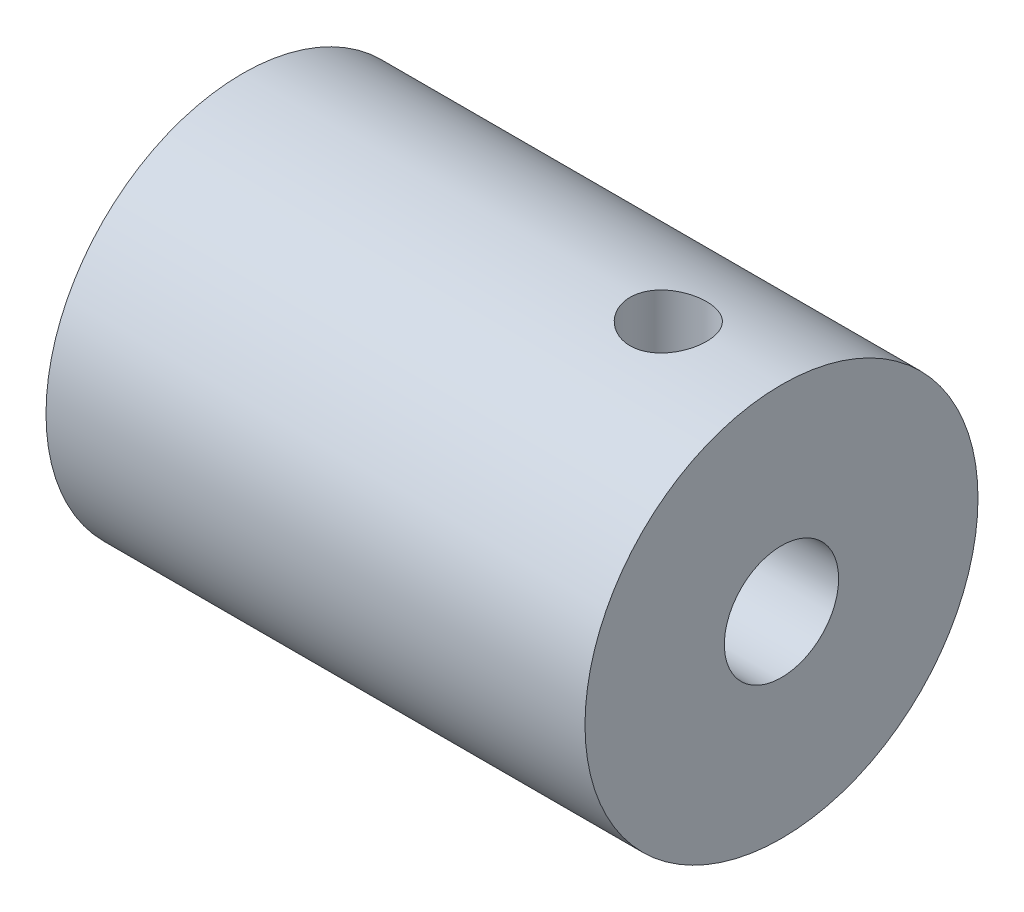
ISO-10303-21;
HEADER;
FILE_DESCRIPTION(('STEP AP214'),'2;1');
FILE_NAME('part.step','',(''),(''),'','','');
FILE_SCHEMA(('AUTOMOTIVE_DESIGN { 1 0 10303 214 1 1 1 1 }'));
ENDSEC;
DATA;
#1=APPLICATION_CONTEXT('core data for automotive mechanical design processes');
#2=APPLICATION_PROTOCOL_DEFINITION('international standard','automotive_design',2000,#1);
#3=PRODUCT_CONTEXT('',#1,'mechanical');
#4=PRODUCT('Part','Part','',(#3));
#5=PRODUCT_RELATED_PRODUCT_CATEGORY('part','',(#4));
#6=PRODUCT_DEFINITION_FORMATION('','',#4);
#7=PRODUCT_DEFINITION_CONTEXT('part definition',#1,'design');
#8=PRODUCT_DEFINITION('design','',#6,#7);
#9=PRODUCT_DEFINITION_SHAPE('','',#8);
#10=(LENGTH_UNIT() NAMED_UNIT(*) SI_UNIT(.MILLI.,.METRE.));
#11=(NAMED_UNIT(*) PLANE_ANGLE_UNIT() SI_UNIT($,.RADIAN.));
#12=(NAMED_UNIT(*) SI_UNIT($,.STERADIAN.) SOLID_ANGLE_UNIT());
#13=UNCERTAINTY_MEASURE_WITH_UNIT(LENGTH_MEASURE(1.E-05),#10,'distance_accuracy_value','');
#14=(GEOMETRIC_REPRESENTATION_CONTEXT(3) GLOBAL_UNCERTAINTY_ASSIGNED_CONTEXT((#13)) GLOBAL_UNIT_ASSIGNED_CONTEXT((#10,
#11,#12)) REPRESENTATION_CONTEXT('',''));
#15=CARTESIAN_POINT('',(0.,0.,0.));
#16=DIRECTION('',(0.,0.,1.));
#17=DIRECTION('',(1.,0.,0.));
#18=AXIS2_PLACEMENT_3D('',#15,#16,#17);
#19=CARTESIAN_POINT('',(19.05,0.,0.));
#20=DIRECTION('',(-1.,0.,0.));
#21=DIRECTION('',(0.,0.,1.));
#22=AXIS2_PLACEMENT_3D('',#19,#20,#21);
#23=CYLINDRICAL_SURFACE('',#22,6.9453125);
#24=CARTESIAN_POINT('',(15.05,6.8123398491382,-1.35255));
#25=CARTESIAN_POINT('',(15.1251963577295,6.81234132944243,-1.35254717398923));
#26=CARTESIAN_POINT('',(15.200428762226,6.81359843401604,-1.34625778721366));
#27=CARTESIAN_POINT('',(15.348768251679,6.81848412206213,-1.32128566413576));
#28=CARTESIAN_POINT('',(15.4218735408361,6.82211465188462,-1.30259275601873));
#29=CARTESIAN_POINT('',(15.5637911387709,6.83132076951789,-1.2534127393944));
#30=CARTESIAN_POINT('',(15.632607526736,6.83689447483278,-1.22293704263114));
#31=CARTESIAN_POINT('',(15.7641477149729,6.84935669337498,-1.15108735760462));
#32=CARTESIAN_POINT('',(15.8268719126619,6.85624512075079,-1.10971408088743));
#33=CARTESIAN_POINT('',(15.9452925006859,6.87066385671159,-1.01665206477721));
#34=CARTESIAN_POINT('',(16.0008952826627,6.87820088946583,-0.964845232866628));
#35=CARTESIAN_POINT('',(16.10267816224,6.89300833236928,-0.852641895271079));
#36=CARTESIAN_POINT('',(16.1488576175121,6.90027872431559,-0.792244804518553));
#37=CARTESIAN_POINT('',(16.2308442848889,6.91380602435712,-0.663957660798625));
#38=CARTESIAN_POINT('',(16.2665628384305,6.92005408202254,-0.59600993407313));
#39=CARTESIAN_POINT('',(16.3260420698983,6.9307573061903,-0.454935726377398));
#40=CARTESIAN_POINT('',(16.3498038086829,6.93521263174426,-0.381809705503897));
#41=CARTESIAN_POINT('',(16.3844043282608,6.94178089710671,-0.233425551842965));
#42=CARTESIAN_POINT('',(16.3954010670289,6.9439224447993,-0.15820553937453));
#43=CARTESIAN_POINT('',(16.4046519738567,6.94572057813347,-0.00695979172285046));
#44=CARTESIAN_POINT('',(16.4029073086999,6.94537739131254,0.0690658690471726));
#45=CARTESIAN_POINT('',(16.3868453102374,6.9422669717941,0.218680332558394));
#46=CARTESIAN_POINT('',(16.3726980950461,6.93953253959101,0.29228817930842));
#47=CARTESIAN_POINT('',(16.3325020833561,6.93198377446194,0.43606478492695));
#48=CARTESIAN_POINT('',(16.3064528284456,6.92716936142506,0.506233411217254));
#49=CARTESIAN_POINT('',(16.2430326622553,6.91594719761631,0.641628535389237));
#50=CARTESIAN_POINT('',(16.2055945231603,6.90953002726852,0.706822730581111));
#51=CARTESIAN_POINT('',(16.1205089749944,6.8958107388115,0.830066733820544));
#52=CARTESIAN_POINT('',(16.0728604493921,6.8885085239584,0.888115759431995));
#53=CARTESIAN_POINT('',(15.9677716391563,6.87368422512004,0.996430503329032));
#54=CARTESIAN_POINT('',(15.9101824922377,6.86616050202488,1.04655167379456));
#55=CARTESIAN_POINT('',(15.7873409912348,6.85185605155822,1.13644734813693));
#56=CARTESIAN_POINT('',(15.7220885068441,6.84507533682456,1.17622167604021));
#57=CARTESIAN_POINT('',(15.5855718504126,6.83302176871437,1.24434075650037));
#58=CARTESIAN_POINT('',(15.5142962361661,6.82775187280059,1.27266313545955));
#59=CARTESIAN_POINT('',(15.3678719235205,6.81936078602225,1.31688875248936));
#60=CARTESIAN_POINT('',(15.2927237027049,6.81623933088277,1.33279351805539));
#61=CARTESIAN_POINT('',(15.1419946128911,6.81255121296574,1.35151853370847));
#62=CARTESIAN_POINT('',(15.0664405857977,6.81194388677569,1.35454706540156));
#63=CARTESIAN_POINT('',(14.9159067067836,6.81324378378274,1.34799319340968));
#64=CARTESIAN_POINT('',(14.8409268243126,6.81515087223908,1.33841146547496));
#65=CARTESIAN_POINT('',(14.6943631450238,6.8212267242659,1.30708830417719));
#66=CARTESIAN_POINT('',(14.622754827821,6.82537494574984,1.28545725904049));
#67=CARTESIAN_POINT('',(14.4841788007416,6.83544778587379,1.23076713319852));
#68=CARTESIAN_POINT('',(14.4172114565884,6.84137254431507,1.19770715308316));
#69=CARTESIAN_POINT('',(14.2889042949397,6.85442277455985,1.12062275552649));
#70=CARTESIAN_POINT('',(14.2276445449578,6.86156222266883,1.07646747728023));
#71=CARTESIAN_POINT('',(14.1133282860528,6.87619863792382,0.978621189653175));
#72=CARTESIAN_POINT('',(14.0602725765284,6.88369563981674,0.924929252117597));
#73=CARTESIAN_POINT('',(13.9630857130608,6.89833385623375,0.808600781761834));
#74=CARTESIAN_POINT('',(13.9190950668739,6.90546833851409,0.745845878648363));
#75=CARTESIAN_POINT('',(13.8422815495203,6.91846222457379,0.613715329874588));
#76=CARTESIAN_POINT('',(13.8094582254823,6.92432168005618,0.5443399528422));
#77=CARTESIAN_POINT('',(13.7561182604404,6.93407647600256,0.401315189591162));
#78=CARTESIAN_POINT('',(13.7355342900877,6.93798254290923,0.327691677235406));
#79=CARTESIAN_POINT('',(13.7070433240212,6.94343635498537,0.177948781292183));
#80=CARTESIAN_POINT('',(13.6991348843364,6.94498436877851,0.101829683005132));
#81=CARTESIAN_POINT('',(13.6962729803831,6.9455417360436,-0.0493992693728448));
#82=CARTESIAN_POINT('',(13.7011078582644,6.94459256651257,-0.12450504619502));
#83=CARTESIAN_POINT('',(13.7231296219406,6.94034898695306,-0.272812141533531));
#84=CARTESIAN_POINT('',(13.7403163686517,6.937054603332,-0.346013481484464));
#85=CARTESIAN_POINT('',(13.7864619917275,6.92849141799562,-0.488310450349137));
#86=CARTESIAN_POINT('',(13.8153966735495,6.92322667591105,-0.55741418495149));
#87=CARTESIAN_POINT('',(13.8841906690659,6.91129094519554,-0.689816781806988));
#88=CARTESIAN_POINT('',(13.9240507906703,6.90461985257679,-0.753115214309866));
#89=CARTESIAN_POINT('',(14.0142844073817,6.89047678695011,-0.873160470640879));
#90=CARTESIAN_POINT('',(14.064809971234,6.88299408712887,-0.929791739208906));
#91=CARTESIAN_POINT('',(14.1746264325819,6.86813654926997,-1.03384496720176));
#92=CARTESIAN_POINT('',(14.2339193962609,6.86076173710927,-1.08126474967521));
#93=CARTESIAN_POINT('',(14.3603060903541,6.84687312303262,-1.16600241942765));
#94=CARTESIAN_POINT('',(14.4274726420297,6.84036878216862,-1.20321330291691));
#95=CARTESIAN_POINT('',(14.5672111257225,6.82907234997402,-1.265762608787));
#96=CARTESIAN_POINT('',(14.6397779967701,6.82427867929455,-1.29111198887677));
#97=CARTESIAN_POINT('',(14.7687757463542,6.81792155952706,-1.32420167504548));
#98=CARTESIAN_POINT('',(14.8244623195154,6.81584115709694,-1.33481362155619));
#99=CARTESIAN_POINT('',(14.9367591328958,6.81304976587542,-1.34898873810212));
#100=CARTESIAN_POINT('',(14.9933693442121,6.8123387343156,-1.35255212827918));
#101=CARTESIAN_POINT('',(15.05,6.8123398491382,-1.35255));
#102=B_SPLINE_CURVE_WITH_KNOTS('',3,(#24,#25,#26,#27,#28,#29,#30,#31,#32,#33,#34,#35,#36,#37,
#38,#39,#40,#41,#42,#43,#44,#45,#46,#47,#48,#49,#50,#51,#52,#53,#54,#55,#56,#57,#58,#59,#60,#61,
#62,#63,#64,#65,#66,#67,#68,#69,#70,#71,#72,#73,#74,#75,#76,#77,#78,#79,#80,#81,#82,#83,#84,#85,
#86,#87,#88,#89,#90,#91,#92,#93,#94,#95,#96,#97,#98,#99,#100,#101),.UNSPECIFIED.,.T.,.F.,(4,2,2,
2,2,2,2,2,2,2,2,2,2,2,2,2,2,2,2,2,2,2,2,2,2,2,2,2,2,2,2,2,2,2,2,2,2,2,4),(0.,0.225381769754468,
0.450948598218698,0.676297508094499,0.901631707695203,1.12967631697796,1.35773646542581,
1.58767697261879,1.81759707493496,2.04464068123138,2.27166349646072,2.49562026008974,
2.71958565022874,2.94489962695416,3.1702382549135,3.39930238955306,3.62837041973823,
3.8578838410403,4.08736902535801,4.31312766682919,4.53887421098822,4.76258583726276,
4.98631507272979,5.21281822177313,5.43934342731297,5.66915209518004,5.89895144244596,
6.12747466637739,6.35597185555189,6.58069787216742,6.80542135837772,7.02968436164319,
7.25396395309363,7.4816881775234,7.7094661547394,7.93954751825051,8.16941590989803,
8.3391570577479,8.5088929041268),.UNSPECIFIED.);
#103=CARTESIAN_POINT('',(15.05,6.8123398491382,-1.35255));
#104=VERTEX_POINT('',#103);
#105=EDGE_CURVE('E67',#104,#104,#102,.T.);
#106=ORIENTED_EDGE('',*,*,#105,.T.);
#107=EDGE_LOOP('',(#106));
#108=FACE_BOUND('',#107,.T.);
#109=CARTESIAN_POINT('',(19.05,0.,0.));
#110=DIRECTION('',(1.,0.,0.));
#111=DIRECTION('',(0.,0.,-1.));
#112=AXIS2_PLACEMENT_3D('',#109,#110,#111);
#113=CIRCLE('',#112,6.9453125);
#114=CARTESIAN_POINT('',(19.05,0.,-6.9453125));
#115=VERTEX_POINT('',#114);
#116=EDGE_CURVE('E11',#115,#115,#113,.T.);
#117=ORIENTED_EDGE('',*,*,#116,.F.);
#118=EDGE_LOOP('',(#117));
#119=FACE_BOUND('',#118,.T.);
#120=CARTESIAN_POINT('',(0.,0.,0.));
#121=DIRECTION('',(1.,0.,0.));
#122=DIRECTION('',(0.,0.,-1.));
#123=AXIS2_PLACEMENT_3D('',#120,#121,#122);
#124=CIRCLE('',#123,6.9453125);
#125=CARTESIAN_POINT('',(0.,0.,-6.9453125));
#126=VERTEX_POINT('',#125);
#127=EDGE_CURVE('E38',#126,#126,#124,.T.);
#128=ORIENTED_EDGE('',*,*,#127,.T.);
#129=EDGE_LOOP('',(#128));
#130=FACE_BOUND('',#129,.T.);
#131=ADVANCED_FACE('F35',(#108,#119,#130),#23,.T.);
#132=CARTESIAN_POINT('',(19.05,0.,0.));
#133=DIRECTION('',(1.,0.,0.));
#134=DIRECTION('',(0.,0.,-1.));
#135=AXIS2_PLACEMENT_3D('',#132,#133,#134);
#136=PLANE('',#135);
#137=CARTESIAN_POINT('',(19.05,0.,0.));
#138=DIRECTION('',(1.,0.,0.));
#139=DIRECTION('',(0.,0.,-1.));
#140=AXIS2_PLACEMENT_3D('',#137,#138,#139);
#141=CIRCLE('',#140,2.01929999999999);
#142=CARTESIAN_POINT('',(19.05,0.,-2.01929999999999));
#143=VERTEX_POINT('',#142);
#144=EDGE_CURVE('E54',#143,#143,#141,.T.);
#145=ORIENTED_EDGE('',*,*,#144,.F.);
#146=EDGE_LOOP('',(#145));
#147=FACE_BOUND('',#146,.T.);
#148=ORIENTED_EDGE('',*,*,#116,.T.);
#149=EDGE_LOOP('',(#148));
#150=FACE_BOUND('',#149,.T.);
#151=ADVANCED_FACE('F85',(#147,#150),#136,.T.);
#152=CARTESIAN_POINT('',(0.,0.,0.));
#153=DIRECTION('',(1.,0.,0.));
#154=DIRECTION('',(0.,0.,-1.));
#155=AXIS2_PLACEMENT_3D('',#152,#153,#154);
#156=PLANE('',#155);
#157=ORIENTED_EDGE('',*,*,#127,.F.);
#158=EDGE_LOOP('',(#157));
#159=FACE_BOUND('',#158,.T.);
#160=ADVANCED_FACE('F48',(#159),#156,.F.);
#161=CARTESIAN_POINT('',(12.0499886,0.,0.));
#162=DIRECTION('',(1.,0.,0.));
#163=DIRECTION('',(0.,0.,-1.));
#164=AXIS2_PLACEMENT_3D('',#161,#162,#163);
#165=CONICAL_SURFACE('',#164,2.01929999999999,1.02974425867665);
#166=CARTESIAN_POINT('',(10.8366707519977,0.,0.));
#167=VERTEX_POINT('',#166);
#168=VERTEX_LOOP('',#167);
#169=FACE_BOUND('',#168,.T.);
#170=CARTESIAN_POINT('',(12.0499886,0.,0.));
#171=DIRECTION('',(1.,0.,0.));
#172=DIRECTION('',(0.,0.,-1.));
#173=AXIS2_PLACEMENT_3D('',#170,#171,#172);
#174=CIRCLE('',#173,2.01929999999999);
#175=CARTESIAN_POINT('',(12.0499886,0.,-2.01929999999999));
#176=VERTEX_POINT('',#175);
#177=EDGE_CURVE('E52',#176,#176,#174,.T.);
#178=ORIENTED_EDGE('',*,*,#177,.T.);
#179=EDGE_LOOP('',(#178));
#180=FACE_BOUND('',#179,.T.);
#181=ADVANCED_FACE('F44',(#169,#180),#165,.F.);
#182=CARTESIAN_POINT('',(19.05,0.,0.));
#183=DIRECTION('',(1.,0.,0.));
#184=DIRECTION('',(0.,0.,-1.));
#185=AXIS2_PLACEMENT_3D('',#182,#183,#184);
#186=CYLINDRICAL_SURFACE('',#185,2.01929999999999);
#187=CARTESIAN_POINT('',(15.05,1.49939353990204,-1.35255));
#188=CARTESIAN_POINT('',(14.9841004087731,1.49940434840804,-1.35254380041712));
#189=CARTESIAN_POINT('',(14.9181515751606,1.50382259731787,-1.34768901249495));
#190=CARTESIAN_POINT('',(14.7886203747452,1.52063637853052,-1.32867751747527));
#191=CARTESIAN_POINT('',(14.7250431646612,1.53304833113076,-1.314501662212));
#192=CARTESIAN_POINT('',(14.6025422120036,1.56361894082946,-1.27797629332161));
#193=CARTESIAN_POINT('',(14.543579031513,1.5817201938109,-1.25570809395549));
#194=CARTESIAN_POINT('',(14.4303264388356,1.62153016132454,-1.20386038892654));
#195=CARTESIAN_POINT('',(14.3760378683645,1.6432395234836,-1.17427957024136));
#196=CARTESIAN_POINT('',(14.2643097028999,1.69191479485549,-1.10323536131488));
#197=CARTESIAN_POINT('',(14.2077193905291,1.71917021004821,-1.06063446266398));
#198=CARTESIAN_POINT('',(14.1017507980569,1.77349653198395,-0.967065961592576));
#199=CARTESIAN_POINT('',(14.0523796945048,1.80056722996342,-0.91609013917948));
#200=CARTESIAN_POINT('',(13.955057930227,1.85614049289305,-0.798219097004071));
#201=CARTESIAN_POINT('',(13.9083732223469,1.88427254705944,-0.730085850808154));
#202=CARTESIAN_POINT('',(13.8275313435529,1.93432289727914,-0.584683649796939));
#203=CARTESIAN_POINT('',(13.7933600885394,1.95624817281529,-0.507425096054492));
#204=CARTESIAN_POINT('',(13.7427328047347,1.98917166857348,-0.35515180458327));
#205=CARTESIAN_POINT('',(13.7247114652308,2.00112457636288,-0.280869760477749));
#206=CARTESIAN_POINT('',(13.7014964703543,2.01657227218721,-0.129498436571045));
#207=CARTESIAN_POINT('',(13.6962864236461,2.02007786797206,-0.0524128720696827));
#208=CARTESIAN_POINT('',(13.6988435388095,2.01836788140775,0.0895408881547876));
#209=CARTESIAN_POINT('',(13.7047420128749,2.01440802841086,0.154468697148764));
#210=CARTESIAN_POINT('',(13.7256314746373,2.0005178321981,0.282177949102503));
#211=CARTESIAN_POINT('',(13.7406231250834,1.99058705379654,0.344959235262297));
#212=CARTESIAN_POINT('',(13.7788618121236,1.96564624647717,0.4665258573));
#213=CARTESIAN_POINT('',(13.802071434946,1.95065925123113,0.525327887664788));
#214=CARTESIAN_POINT('',(13.8558434877525,1.91670464102705,0.638195419675022));
#215=CARTESIAN_POINT('',(13.8864072383299,1.89773631121212,0.692260068239309));
#216=CARTESIAN_POINT('',(13.9584922472908,1.85435493805525,0.801779402175277));
#217=CARTESIAN_POINT('',(14.0009269463546,1.82955375865744,0.856477363841794));
#218=CARTESIAN_POINT('',(14.0931789589937,1.77826207252142,0.958448230635065));
#219=CARTESIAN_POINT('',(14.1430076818395,1.75176899175344,1.00570942410655));
#220=CARTESIAN_POINT('',(14.257713893912,1.69499965905825,1.09907960384728));
#221=CARTESIAN_POINT('',(14.3237257486945,1.66478294847517,1.14384109128564));
#222=CARTESIAN_POINT('',(14.4639626091151,1.60857705620192,1.22161958976007));
#223=CARTESIAN_POINT('',(14.5381737041258,1.58258089364044,1.25465610376161));
#224=CARTESIAN_POINT('',(14.6713310924404,1.54555608514135,1.29977911769434));
#225=CARTESIAN_POINT('',(14.7285567286291,1.53237306258065,1.31515627826555));
#226=CARTESIAN_POINT('',(14.845542775869,1.51217866490722,1.33833099679276));
#227=CARTESIAN_POINT('',(14.9052986034454,1.50515659168984,1.34614169590406));
#228=CARTESIAN_POINT('',(15.0260254289342,1.4983705888663,1.35369431311021));
#229=CARTESIAN_POINT('',(15.0870007273873,1.49863992320187,1.353399252036));
#230=CARTESIAN_POINT('',(15.2079025827395,1.5064742572483,1.34467019046974));
#231=CARTESIAN_POINT('',(15.2678283918729,1.51404425930276,1.33623060943252));
#232=CARTESIAN_POINT('',(15.3818939855673,1.53471144288397,1.31242568254404));
#233=CARTESIAN_POINT('',(15.4361726807079,1.54750185296761,1.29744192385913));
#234=CARTESIAN_POINT('',(15.5414867105181,1.57707971238788,1.26132340540602));
#235=CARTESIAN_POINT('',(15.5925195018992,1.59387024826094,1.24018389298371));
#236=CARTESIAN_POINT('',(15.7139359314497,1.63843424142878,1.18111491098168));
#237=CARTESIAN_POINT('',(15.7822193080627,1.66767366029887,1.13995560148576));
#238=CARTESIAN_POINT('',(15.9102271196545,1.72770696167432,1.04674977919184));
#239=CARTESIAN_POINT('',(15.9699360008934,1.75850353536277,0.994683892553142));
#240=CARTESIAN_POINT('',(16.0802460085189,1.81863691498855,0.879977797646333));
#241=CARTESIAN_POINT('',(16.1307720167779,1.84796037504405,0.817257844905231));
#242=CARTESIAN_POINT('',(16.2205364329945,1.901854777317,0.682467587180216));
#243=CARTESIAN_POINT('',(16.2597974951729,1.92643522481859,0.610416477332822));
#244=CARTESIAN_POINT('',(16.3180179628152,1.96358546089694,0.475087060321365));
#245=CARTESIAN_POINT('',(16.3395351782279,1.97760455153168,0.413305596365028));
#246=CARTESIAN_POINT('',(16.3735288480064,1.99993583901005,0.286310310177953));
#247=CARTESIAN_POINT('',(16.386011342898,2.00825184868213,0.221098812581812));
#248=CARTESIAN_POINT('',(16.4012758771694,2.01843867211472,0.0888260869881329));
#249=CARTESIAN_POINT('',(16.4040268851633,2.0202888677132,0.0217596278273706));
#250=CARTESIAN_POINT('',(16.3995710690667,2.01730519907374,-0.1118934832221));
#251=CARTESIAN_POINT('',(16.3923635435402,2.01247086400632,-0.178480100980771));
#252=CARTESIAN_POINT('',(16.3690307416601,1.99698584639458,-0.305830758926299));
#253=CARTESIAN_POINT('',(16.3533711078541,1.98663920185109,-0.366719308703053));
#254=CARTESIAN_POINT('',(16.3142001963875,1.96116352276967,-0.484834335472368));
#255=CARTESIAN_POINT('',(16.2906875266963,1.94603364037957,-0.542060161065205));
#256=CARTESIAN_POINT('',(16.2344496570189,1.91065031731657,-0.656397683708508));
#257=CARTESIAN_POINT('',(16.2011268113323,1.89007832163395,-0.713114672528181));
#258=CARTESIAN_POINT('',(16.1272892515601,1.84603758926831,-0.8204197646913));
#259=CARTESIAN_POINT('',(16.086768799484,1.82256654602278,-0.87100292355459));
#260=CARTESIAN_POINT('',(15.992142560397,1.77031196313711,-0.973336741993324));
#261=CARTESIAN_POINT('',(15.9368985418343,1.74128908056346,-1.02391432610699));
#262=CARTESIAN_POINT('',(15.8185301200316,1.68408214065503,-1.11550661334593));
#263=CARTESIAN_POINT('',(15.755402593083,1.65589842133739,-1.15651750725336));
#264=CARTESIAN_POINT('',(15.6317865011114,1.6074581611413,-1.22273363241224));
#265=CARTESIAN_POINT('',(15.5722911611534,1.58664576122133,-1.24938003789393));
#266=CARTESIAN_POINT('',(15.448685701922,1.55037865397612,-1.29411514387335));
#267=CARTESIAN_POINT('',(15.3845879925878,1.5349101474017,-1.31222593021663));
#268=CARTESIAN_POINT('',(15.2750588033033,1.51557600324735,-1.33444362987136));
#269=CARTESIAN_POINT('',(15.2305369008951,1.50956094924448,-1.34120696433126));
#270=CARTESIAN_POINT('',(15.1406843647595,1.50146627177689,-1.35026197192447));
#271=CARTESIAN_POINT('',(15.0953538443481,1.4993861012019,-1.35255426671716));
#272=CARTESIAN_POINT('',(15.05,1.49939353990204,-1.35255));
#273=B_SPLINE_CURVE_WITH_KNOTS('',3,(#187,#188,#189,#190,#191,#192,#193,#194,#195,#196,#197,
#198,#199,#200,#201,#202,#203,#204,#205,#206,#207,#208,#209,#210,#211,#212,#213,#214,#215,#216,
#217,#218,#219,#220,#221,#222,#223,#224,#225,#226,#227,#228,#229,#230,#231,#232,#233,#234,#235,
#236,#237,#238,#239,#240,#241,#242,#243,#244,#245,#246,#247,#248,#249,#250,#251,#252,#253,#254,
#255,#256,#257,#258,#259,#260,#261,#262,#263,#264,#265,#266,#267,#268,#269,#270,#271,#272),
.UNSPECIFIED.,.T.,.F.,(4,2,2,2,2,2,2,2,2,2,2,2,2,2,2,2,2,2,2,2,2,2,2,2,2,2,2,2,2,2,2,2,2,2,2,2,
2,2,2,2,2,2,4),(0.,0.197488042156292,0.39538305465954,0.591342185970881,0.787336528446656,
1.01418414252226,1.24125575259872,1.50156823101369,1.76158681629331,1.99222790940561,
2.22257375618545,2.41757271673043,2.61258589132753,2.80672241420124,3.00089382455507,
3.22066850644044,3.44078590529781,3.69548459277063,3.94975761436904,4.13115708260428,
4.31224093498318,4.49415104394827,4.67618588449813,4.8487869533339,5.02152163668222,
5.27496864227351,5.52886973394323,5.78476250439876,6.04013699921621,6.24000761707669,
6.43974447964718,6.64011768404859,6.84050500259221,7.03083686411817,7.22120248182578,
7.42718936360725,7.63334120290144,7.87335617493057,8.11346655243829,8.31802494544483,
8.52205109928024,8.65798650329677,8.79390300532363),.UNSPECIFIED.);
#274=CARTESIAN_POINT('',(15.05,1.49939353990204,-1.35255));
#275=VERTEX_POINT('',#274);
#276=EDGE_CURVE('E58',#275,#275,#273,.T.);
#277=ORIENTED_EDGE('',*,*,#276,.T.);
#278=EDGE_LOOP('',(#277));
#279=FACE_BOUND('',#278,.T.);
#280=ORIENTED_EDGE('',*,*,#177,.F.);
#281=EDGE_LOOP('',(#280));
#282=FACE_BOUND('',#281,.T.);
#283=ORIENTED_EDGE('',*,*,#144,.T.);
#284=EDGE_LOOP('',(#283));
#285=FACE_BOUND('',#284,.T.);
#286=ADVANCED_FACE('F47',(#279,#282,#285),#186,.F.);
#287=CARTESIAN_POINT('',(15.05,0.,0.));
#288=DIRECTION('',(0.,-1.,0.));
#289=DIRECTION('',(0.,0.,-1.));
#290=AXIS2_PLACEMENT_3D('',#287,#288,#289);
#291=CYLINDRICAL_SURFACE('',#290,1.35255);
#292=ORIENTED_EDGE('',*,*,#105,.F.);
#293=EDGE_LOOP('',(#292));
#294=FACE_BOUND('',#293,.T.);
#295=ORIENTED_EDGE('',*,*,#276,.F.);
#296=EDGE_LOOP('',(#295));
#297=FACE_BOUND('',#296,.T.);
#298=ADVANCED_FACE('F72',(#294,#297),#291,.F.);
#299=CLOSED_SHELL('',(#131,#151,#160,#181,#286,#298));
#300=MANIFOLD_SOLID_BREP('B2',#299);
#301=ADVANCED_BREP_SHAPE_REPRESENTATION('',(#18,#300),#14);
#302=SHAPE_DEFINITION_REPRESENTATION(#9,#301);
ENDSEC;
END-ISO-10303-21;
